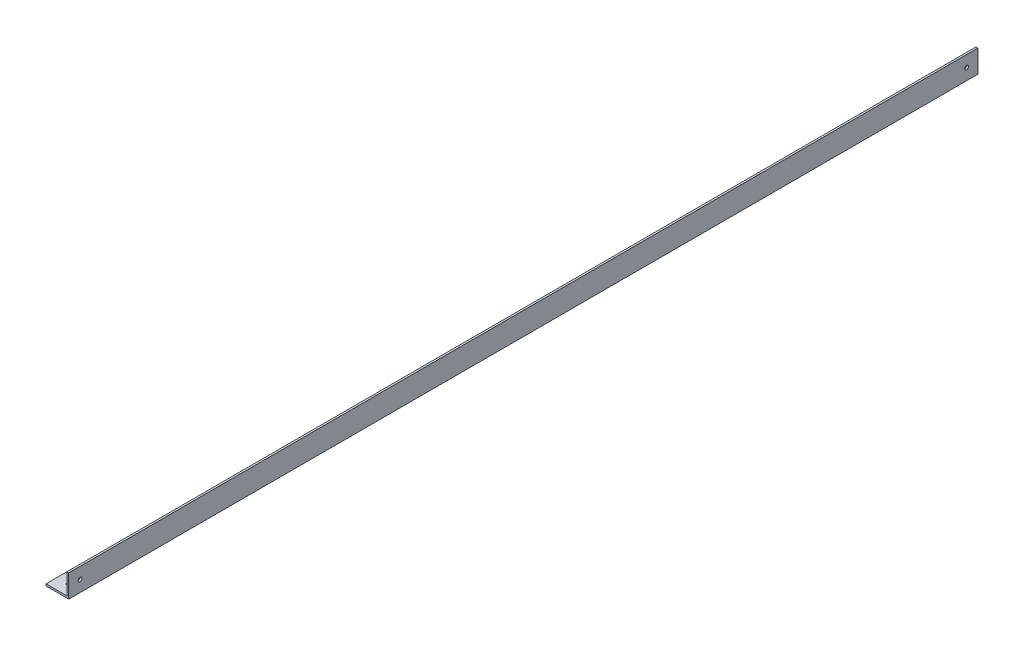
ISO-10303-21;
HEADER;
FILE_DESCRIPTION(('STEP AP214'),'2;1');
FILE_NAME('part.step','',(''),(''),'','','');
FILE_SCHEMA(('AUTOMOTIVE_DESIGN { 1 0 10303 214 1 1 1 1 }'));
ENDSEC;
DATA;
#1=APPLICATION_CONTEXT('core data for automotive mechanical design processes');
#2=APPLICATION_PROTOCOL_DEFINITION('international standard','automotive_design',2000,#1);
#3=PRODUCT_CONTEXT('',#1,'mechanical');
#4=PRODUCT('Part','Part','',(#3));
#5=PRODUCT_RELATED_PRODUCT_CATEGORY('part','',(#4));
#6=PRODUCT_DEFINITION_FORMATION('','',#4);
#7=PRODUCT_DEFINITION_CONTEXT('part definition',#1,'design');
#8=PRODUCT_DEFINITION('design','',#6,#7);
#9=PRODUCT_DEFINITION_SHAPE('','',#8);
#10=(LENGTH_UNIT() NAMED_UNIT(*) SI_UNIT(.MILLI.,.METRE.));
#11=(NAMED_UNIT(*) PLANE_ANGLE_UNIT() SI_UNIT($,.RADIAN.));
#12=(NAMED_UNIT(*) SI_UNIT($,.STERADIAN.) SOLID_ANGLE_UNIT());
#13=UNCERTAINTY_MEASURE_WITH_UNIT(LENGTH_MEASURE(1.E-05),#10,'distance_accuracy_value','');
#14=(GEOMETRIC_REPRESENTATION_CONTEXT(3) GLOBAL_UNCERTAINTY_ASSIGNED_CONTEXT((#13)) GLOBAL_UNIT_ASSIGNED_CONTEXT((#10,
#11,#12)) REPRESENTATION_CONTEXT('',''));
#15=CARTESIAN_POINT('',(0.,0.,0.));
#16=DIRECTION('',(0.,0.,1.));
#17=DIRECTION('',(1.,0.,0.));
#18=AXIS2_PLACEMENT_3D('',#15,#16,#17);
#19=CARTESIAN_POINT('',(0.,0.,-762.));
#20=DIRECTION('',(0.,-1.,0.));
#21=DIRECTION('',(0.,0.,-1.));
#22=AXIS2_PLACEMENT_3D('',#19,#20,#21);
#23=PLANE('',#22);
#24=DIRECTION('',(0.,0.,1.));
#25=VECTOR('',#24,1.);
#26=CARTESIAN_POINT('',(19.05,0.,-762.));
#27=LINE('',#26,#25);
#28=CARTESIAN_POINT('',(19.05,0.,-762.));
#29=VERTEX_POINT('',#28);
#30=CARTESIAN_POINT('',(19.05,0.,0.));
#31=VERTEX_POINT('',#30);
#32=EDGE_CURVE('E52',#29,#31,#27,.T.);
#33=ORIENTED_EDGE('',*,*,#32,.F.);
#34=DIRECTION('',(1.,0.,0.));
#35=VECTOR('',#34,1.);
#36=CARTESIAN_POINT('',(0.,0.,-762.));
#37=LINE('',#36,#35);
#38=CARTESIAN_POINT('',(38.1,0.,-762.));
#39=VERTEX_POINT('',#38);
#40=EDGE_CURVE('E44',#29,#39,#37,.T.);
#41=ORIENTED_EDGE('',*,*,#40,.T.);
#42=DIRECTION('',(0.,0.,1.));
#43=VECTOR('',#42,1.);
#44=CARTESIAN_POINT('',(38.1,0.,-762.));
#45=LINE('',#44,#43);
#46=CARTESIAN_POINT('',(38.1,0.,0.));
#47=VERTEX_POINT('',#46);
#48=EDGE_CURVE('E111',#39,#47,#45,.T.);
#49=ORIENTED_EDGE('',*,*,#48,.T.);
#50=DIRECTION('',(1.,0.,0.));
#51=VECTOR('',#50,1.);
#52=CARTESIAN_POINT('',(0.,0.,0.));
#53=LINE('',#52,#51);
#54=EDGE_CURVE('E102',#31,#47,#53,.T.);
#55=ORIENTED_EDGE('',*,*,#54,.F.);
#56=EDGE_LOOP('',(#33,#41,#49,#55));
#57=FACE_BOUND('',#56,.T.);
#58=CARTESIAN_POINT('',(28.575,0.,-9.525));
#59=DIRECTION('',(0.,-1.,0.));
#60=DIRECTION('',(0.,0.,-1.));
#61=AXIS2_PLACEMENT_3D('',#58,#59,#60);
#62=CIRCLE('',#61,1.5875);
#63=CARTESIAN_POINT('',(28.575,0.,-11.1125));
#64=VERTEX_POINT('',#63);
#65=EDGE_CURVE('E151',#64,#64,#62,.F.);
#66=ORIENTED_EDGE('',*,*,#65,.T.);
#67=EDGE_LOOP('',(#66));
#68=FACE_BOUND('',#67,.T.);
#69=CARTESIAN_POINT('',(28.575,0.,-703.58));
#70=DIRECTION('',(0.,-1.,0.));
#71=DIRECTION('',(0.,0.,-1.));
#72=AXIS2_PLACEMENT_3D('',#69,#70,#71);
#73=CIRCLE('',#72,3.175);
#74=CARTESIAN_POINT('',(28.575,0.,-706.755));
#75=VERTEX_POINT('',#74);
#76=EDGE_CURVE('E148',#75,#75,#73,.F.);
#77=ORIENTED_EDGE('',*,*,#76,.T.);
#78=EDGE_LOOP('',(#77));
#79=FACE_BOUND('',#78,.T.);
#80=CARTESIAN_POINT('',(28.575,0.,-76.2));
#81=DIRECTION('',(0.,-1.,0.));
#82=DIRECTION('',(0.,0.,-1.));
#83=AXIS2_PLACEMENT_3D('',#80,#81,#82);
#84=CIRCLE('',#83,3.175);
#85=CARTESIAN_POINT('',(28.575,0.,-79.375));
#86=VERTEX_POINT('',#85);
#87=EDGE_CURVE('E145',#86,#86,#84,.F.);
#88=ORIENTED_EDGE('',*,*,#87,.T.);
#89=EDGE_LOOP('',(#88));
#90=FACE_BOUND('',#89,.T.);
#91=CARTESIAN_POINT('',(28.575,0.,-752.475));
#92=DIRECTION('',(0.,-1.,0.));
#93=DIRECTION('',(0.,0.,-1.));
#94=AXIS2_PLACEMENT_3D('',#91,#92,#93);
#95=CIRCLE('',#94,1.58750000000003);
#96=CARTESIAN_POINT('',(28.575,0.,-754.0625));
#97=VERTEX_POINT('',#96);
#98=EDGE_CURVE('E134',#97,#97,#95,.F.);
#99=ORIENTED_EDGE('',*,*,#98,.T.);
#100=EDGE_LOOP('',(#99));
#101=FACE_BOUND('',#100,.T.);
#102=ADVANCED_FACE('F36',(#57,#68,#79,#90,#101),#23,.T.);
#103=CARTESIAN_POINT('',(19.05,1.5875,-762.));
#104=DIRECTION('',(0.,1.,0.));
#105=DIRECTION('',(0.,0.,1.));
#106=AXIS2_PLACEMENT_3D('',#103,#104,#105);
#107=PLANE('',#106);
#108=DIRECTION('',(0.,0.,-1.));
#109=VECTOR('',#108,1.);
#110=CARTESIAN_POINT('',(19.05,1.5875,-762.));
#111=LINE('',#110,#109);
#112=CARTESIAN_POINT('',(19.05,1.5875,0.));
#113=VERTEX_POINT('',#112);
#114=CARTESIAN_POINT('',(19.05,1.5875,-762.));
#115=VERTEX_POINT('',#114);
#116=EDGE_CURVE('E97',#113,#115,#111,.T.);
#117=ORIENTED_EDGE('',*,*,#116,.F.);
#118=DIRECTION('',(-1.,0.,0.));
#119=VECTOR('',#118,1.);
#120=CARTESIAN_POINT('',(19.05,1.5875,0.));
#121=LINE('',#120,#119);
#122=CARTESIAN_POINT('',(36.5125,1.5875,0.));
#123=VERTEX_POINT('',#122);
#124=EDGE_CURVE('E80',#123,#113,#121,.T.);
#125=ORIENTED_EDGE('',*,*,#124,.F.);
#126=DIRECTION('',(0.,0.,1.));
#127=VECTOR('',#126,1.);
#128=CARTESIAN_POINT('',(36.5125,1.5875,-762.));
#129=LINE('',#128,#127);
#130=CARTESIAN_POINT('',(36.5125,1.5875,-762.));
#131=VERTEX_POINT('',#130);
#132=EDGE_CURVE('E114',#131,#123,#129,.T.);
#133=ORIENTED_EDGE('',*,*,#132,.F.);
#134=DIRECTION('',(-1.,0.,0.));
#135=VECTOR('',#134,1.);
#136=CARTESIAN_POINT('',(19.05,1.5875,-762.));
#137=LINE('',#136,#135);
#138=EDGE_CURVE('E11',#131,#115,#137,.T.);
#139=ORIENTED_EDGE('',*,*,#138,.T.);
#140=EDGE_LOOP('',(#117,#125,#133,#139));
#141=FACE_BOUND('',#140,.T.);
#142=CARTESIAN_POINT('',(28.575,1.5875,-9.525));
#143=DIRECTION('',(0.,-1.,0.));
#144=DIRECTION('',(0.,0.,1.));
#145=AXIS2_PLACEMENT_3D('',#142,#143,#144);
#146=CIRCLE('',#145,1.5875);
#147=CARTESIAN_POINT('',(28.575,1.5875,-7.9375));
#148=VERTEX_POINT('',#147);
#149=EDGE_CURVE('E131',#148,#148,#146,.T.);
#150=ORIENTED_EDGE('',*,*,#149,.T.);
#151=EDGE_LOOP('',(#150));
#152=FACE_BOUND('',#151,.T.);
#153=CARTESIAN_POINT('',(28.575,1.5875,-703.58));
#154=DIRECTION('',(0.,-1.,0.));
#155=DIRECTION('',(0.,0.,1.));
#156=AXIS2_PLACEMENT_3D('',#153,#154,#155);
#157=CIRCLE('',#156,3.175);
#158=CARTESIAN_POINT('',(28.575,1.5875,-700.405));
#159=VERTEX_POINT('',#158);
#160=EDGE_CURVE('E121',#159,#159,#157,.T.);
#161=ORIENTED_EDGE('',*,*,#160,.T.);
#162=EDGE_LOOP('',(#161));
#163=FACE_BOUND('',#162,.T.);
#164=CARTESIAN_POINT('',(28.575,1.5875,-76.2));
#165=DIRECTION('',(0.,-1.,0.));
#166=DIRECTION('',(0.,0.,1.));
#167=AXIS2_PLACEMENT_3D('',#164,#165,#166);
#168=CIRCLE('',#167,3.175);
#169=CARTESIAN_POINT('',(28.575,1.5875,-73.025));
#170=VERTEX_POINT('',#169);
#171=EDGE_CURVE('E138',#170,#170,#168,.T.);
#172=ORIENTED_EDGE('',*,*,#171,.T.);
#173=EDGE_LOOP('',(#172));
#174=FACE_BOUND('',#173,.T.);
#175=CARTESIAN_POINT('',(28.575,1.5875,-752.475));
#176=DIRECTION('',(0.,-1.,0.));
#177=DIRECTION('',(0.,0.,1.));
#178=AXIS2_PLACEMENT_3D('',#175,#176,#177);
#179=CIRCLE('',#178,1.58750000000003);
#180=CARTESIAN_POINT('',(28.575,1.5875,-750.8875));
#181=VERTEX_POINT('',#180);
#182=EDGE_CURVE('E135',#181,#181,#179,.T.);
#183=ORIENTED_EDGE('',*,*,#182,.T.);
#184=EDGE_LOOP('',(#183));
#185=FACE_BOUND('',#184,.T.);
#186=ADVANCED_FACE('F180',(#141,#152,#163,#174,#185),#107,.T.);
#187=CARTESIAN_POINT('',(0.,0.,-762.));
#188=DIRECTION('',(0.,0.,1.));
#189=DIRECTION('',(1.,0.,0.));
#190=AXIS2_PLACEMENT_3D('',#187,#188,#189);
#191=PLANE('',#190);
#192=ORIENTED_EDGE('',*,*,#40,.F.);
#193=DIRECTION('',(0.,1.,0.));
#194=VECTOR('',#193,1.);
#195=CARTESIAN_POINT('',(19.05,19.05,-762.));
#196=LINE('',#195,#194);
#197=EDGE_CURVE('E95',#29,#115,#196,.T.);
#198=ORIENTED_EDGE('',*,*,#197,.T.);
#199=ORIENTED_EDGE('',*,*,#138,.F.);
#200=DIRECTION('',(0.,1.,0.));
#201=VECTOR('',#200,1.);
#202=CARTESIAN_POINT('',(36.5125,1.5875,-762.));
#203=LINE('',#202,#201);
#204=CARTESIAN_POINT('',(36.5125,19.05,-762.));
#205=VERTEX_POINT('',#204);
#206=EDGE_CURVE('E159',#131,#205,#203,.T.);
#207=ORIENTED_EDGE('',*,*,#206,.T.);
#208=DIRECTION('',(1.,0.,0.));
#209=VECTOR('',#208,1.);
#210=CARTESIAN_POINT('',(38.1,19.05,-762.));
#211=LINE('',#210,#209);
#212=CARTESIAN_POINT('',(38.1,19.05,-762.));
#213=VERTEX_POINT('',#212);
#214=EDGE_CURVE('E156',#205,#213,#211,.T.);
#215=ORIENTED_EDGE('',*,*,#214,.T.);
#216=DIRECTION('',(0.,-1.,0.));
#217=VECTOR('',#216,1.);
#218=CARTESIAN_POINT('',(38.1,0.,-762.));
#219=LINE('',#218,#217);
#220=EDGE_CURVE('E106',#213,#39,#219,.T.);
#221=ORIENTED_EDGE('',*,*,#220,.T.);
#222=EDGE_LOOP('',(#192,#198,#199,#207,#215,#221));
#223=FACE_BOUND('',#222,.T.);
#224=ADVANCED_FACE('F104',(#223),#191,.F.);
#225=CARTESIAN_POINT('',(0.,0.,0.));
#226=DIRECTION('',(0.,0.,1.));
#227=DIRECTION('',(1.,0.,0.));
#228=AXIS2_PLACEMENT_3D('',#225,#226,#227);
#229=PLANE('',#228);
#230=DIRECTION('',(0.,1.,0.));
#231=VECTOR('',#230,1.);
#232=CARTESIAN_POINT('',(19.05,19.05,0.));
#233=LINE('',#232,#231);
#234=EDGE_CURVE('E98',#31,#113,#233,.T.);
#235=ORIENTED_EDGE('',*,*,#234,.F.);
#236=ORIENTED_EDGE('',*,*,#54,.T.);
#237=DIRECTION('',(0.,-1.,0.));
#238=VECTOR('',#237,1.);
#239=CARTESIAN_POINT('',(38.1,0.,0.));
#240=LINE('',#239,#238);
#241=CARTESIAN_POINT('',(38.1,19.05,0.));
#242=VERTEX_POINT('',#241);
#243=EDGE_CURVE('E154',#242,#47,#240,.T.);
#244=ORIENTED_EDGE('',*,*,#243,.F.);
#245=DIRECTION('',(1.,0.,0.));
#246=VECTOR('',#245,1.);
#247=CARTESIAN_POINT('',(38.1,19.05,0.));
#248=LINE('',#247,#246);
#249=CARTESIAN_POINT('',(36.5125,19.05,0.));
#250=VERTEX_POINT('',#249);
#251=EDGE_CURVE('E163',#250,#242,#248,.T.);
#252=ORIENTED_EDGE('',*,*,#251,.F.);
#253=DIRECTION('',(0.,1.,0.));
#254=VECTOR('',#253,1.);
#255=CARTESIAN_POINT('',(36.5125,1.5875,0.));
#256=LINE('',#255,#254);
#257=EDGE_CURVE('E157',#123,#250,#256,.T.);
#258=ORIENTED_EDGE('',*,*,#257,.F.);
#259=ORIENTED_EDGE('',*,*,#124,.T.);
#260=EDGE_LOOP('',(#235,#236,#244,#252,#258,#259));
#261=FACE_BOUND('',#260,.T.);
#262=ADVANCED_FACE('F177',(#261),#229,.T.);
#263=CARTESIAN_POINT('',(36.5125,1.5875,-762.));
#264=DIRECTION('',(1.,0.,0.));
#265=DIRECTION('',(0.,0.,-1.));
#266=AXIS2_PLACEMENT_3D('',#263,#264,#265);
#267=PLANE('',#266);
#268=CARTESIAN_POINT('',(36.5125,9.525,-752.475));
#269=DIRECTION('',(1.,0.,0.));
#270=DIRECTION('',(0.,0.,-1.));
#271=AXIS2_PLACEMENT_3D('',#268,#269,#270);
#272=CIRCLE('',#271,1.58749999999993);
#273=CARTESIAN_POINT('',(36.5125,9.525,-750.8875));
#274=VERTEX_POINT('',#273);
#275=EDGE_CURVE('E117',#274,#274,#272,.T.);
#276=ORIENTED_EDGE('',*,*,#275,.T.);
#277=EDGE_LOOP('',(#276));
#278=FACE_BOUND('',#277,.T.);
#279=CARTESIAN_POINT('',(36.5125,9.525,-9.525));
#280=DIRECTION('',(1.,0.,0.));
#281=DIRECTION('',(0.,0.,-1.));
#282=AXIS2_PLACEMENT_3D('',#279,#280,#281);
#283=CIRCLE('',#282,1.5875);
#284=CARTESIAN_POINT('',(36.5125,9.525,-7.9375));
#285=VERTEX_POINT('',#284);
#286=EDGE_CURVE('E123',#285,#285,#283,.T.);
#287=ORIENTED_EDGE('',*,*,#286,.T.);
#288=EDGE_LOOP('',(#287));
#289=FACE_BOUND('',#288,.T.);
#290=ORIENTED_EDGE('',*,*,#257,.T.);
#291=DIRECTION('',(0.,0.,1.));
#292=VECTOR('',#291,1.);
#293=CARTESIAN_POINT('',(36.5125,19.05,-762.));
#294=LINE('',#293,#292);
#295=EDGE_CURVE('E167',#205,#250,#294,.T.);
#296=ORIENTED_EDGE('',*,*,#295,.F.);
#297=ORIENTED_EDGE('',*,*,#206,.F.);
#298=ORIENTED_EDGE('',*,*,#132,.T.);
#299=EDGE_LOOP('',(#290,#296,#297,#298));
#300=FACE_BOUND('',#299,.T.);
#301=ADVANCED_FACE('F185',(#278,#289,#300),#267,.F.);
#302=CARTESIAN_POINT('',(38.1,19.05,-762.));
#303=DIRECTION('',(0.,-1.,0.));
#304=DIRECTION('',(0.,0.,-1.));
#305=AXIS2_PLACEMENT_3D('',#302,#303,#304);
#306=PLANE('',#305);
#307=ORIENTED_EDGE('',*,*,#251,.T.);
#308=DIRECTION('',(0.,0.,1.));
#309=VECTOR('',#308,1.);
#310=CARTESIAN_POINT('',(38.1,19.05,-762.));
#311=LINE('',#310,#309);
#312=EDGE_CURVE('E169',#213,#242,#311,.T.);
#313=ORIENTED_EDGE('',*,*,#312,.F.);
#314=ORIENTED_EDGE('',*,*,#214,.F.);
#315=ORIENTED_EDGE('',*,*,#295,.T.);
#316=EDGE_LOOP('',(#307,#313,#314,#315));
#317=FACE_BOUND('',#316,.T.);
#318=ADVANCED_FACE('F188',(#317),#306,.F.);
#319=CARTESIAN_POINT('',(38.1,0.,-762.));
#320=DIRECTION('',(-1.,0.,0.));
#321=DIRECTION('',(0.,0.,1.));
#322=AXIS2_PLACEMENT_3D('',#319,#320,#321);
#323=PLANE('',#322);
#324=CARTESIAN_POINT('',(38.1,9.525,-752.475));
#325=DIRECTION('',(-1.,0.,0.));
#326=DIRECTION('',(0.,0.,1.));
#327=AXIS2_PLACEMENT_3D('',#324,#325,#326);
#328=CIRCLE('',#327,1.58749999999993);
#329=CARTESIAN_POINT('',(38.1,9.525,-750.8875));
#330=VERTEX_POINT('',#329);
#331=EDGE_CURVE('E39',#330,#330,#328,.F.);
#332=ORIENTED_EDGE('',*,*,#331,.F.);
#333=EDGE_LOOP('',(#332));
#334=FACE_BOUND('',#333,.T.);
#335=CARTESIAN_POINT('',(38.1,9.525,-9.525));
#336=DIRECTION('',(-1.,0.,0.));
#337=DIRECTION('',(0.,0.,1.));
#338=AXIS2_PLACEMENT_3D('',#335,#336,#337);
#339=CIRCLE('',#338,1.5875);
#340=CARTESIAN_POINT('',(38.1,9.525,-7.9375));
#341=VERTEX_POINT('',#340);
#342=EDGE_CURVE('E115',#341,#341,#339,.F.);
#343=ORIENTED_EDGE('',*,*,#342,.F.);
#344=EDGE_LOOP('',(#343));
#345=FACE_BOUND('',#344,.T.);
#346=ORIENTED_EDGE('',*,*,#243,.T.);
#347=ORIENTED_EDGE('',*,*,#48,.F.);
#348=ORIENTED_EDGE('',*,*,#220,.F.);
#349=ORIENTED_EDGE('',*,*,#312,.T.);
#350=EDGE_LOOP('',(#346,#347,#348,#349));
#351=FACE_BOUND('',#350,.T.);
#352=ADVANCED_FACE('F174',(#334,#345,#351),#323,.F.);
#353=CARTESIAN_POINT('',(28.575,-1.2065,-752.475));
#354=DIRECTION('',(0.,1.,0.));
#355=DIRECTION('',(0.,0.,1.));
#356=AXIS2_PLACEMENT_3D('',#353,#354,#355);
#357=CYLINDRICAL_SURFACE('',#356,1.58750000000003);
#358=ORIENTED_EDGE('',*,*,#98,.F.);
#359=EDGE_LOOP('',(#358));
#360=FACE_BOUND('',#359,.T.);
#361=ORIENTED_EDGE('',*,*,#182,.F.);
#362=EDGE_LOOP('',(#361));
#363=FACE_BOUND('',#362,.T.);
#364=ADVANCED_FACE('F195',(#360,#363),#357,.F.);
#365=CARTESIAN_POINT('',(28.575,-1.2065,-76.2));
#366=DIRECTION('',(0.,1.,0.));
#367=DIRECTION('',(0.,0.,1.));
#368=AXIS2_PLACEMENT_3D('',#365,#366,#367);
#369=CYLINDRICAL_SURFACE('',#368,3.175);
#370=ORIENTED_EDGE('',*,*,#87,.F.);
#371=EDGE_LOOP('',(#370));
#372=FACE_BOUND('',#371,.T.);
#373=ORIENTED_EDGE('',*,*,#171,.F.);
#374=EDGE_LOOP('',(#373));
#375=FACE_BOUND('',#374,.T.);
#376=ADVANCED_FACE('F237',(#372,#375),#369,.F.);
#377=CARTESIAN_POINT('',(28.575,-1.2065,-703.58));
#378=DIRECTION('',(0.,1.,0.));
#379=DIRECTION('',(0.,0.,1.));
#380=AXIS2_PLACEMENT_3D('',#377,#378,#379);
#381=CYLINDRICAL_SURFACE('',#380,3.175);
#382=ORIENTED_EDGE('',*,*,#76,.F.);
#383=EDGE_LOOP('',(#382));
#384=FACE_BOUND('',#383,.T.);
#385=ORIENTED_EDGE('',*,*,#160,.F.);
#386=EDGE_LOOP('',(#385));
#387=FACE_BOUND('',#386,.T.);
#388=ADVANCED_FACE('F247',(#384,#387),#381,.F.);
#389=CARTESIAN_POINT('',(28.575,-1.2065,-9.525));
#390=DIRECTION('',(0.,1.,0.));
#391=DIRECTION('',(0.,0.,1.));
#392=AXIS2_PLACEMENT_3D('',#389,#390,#391);
#393=CYLINDRICAL_SURFACE('',#392,1.5875);
#394=ORIENTED_EDGE('',*,*,#65,.F.);
#395=EDGE_LOOP('',(#394));
#396=FACE_BOUND('',#395,.T.);
#397=ORIENTED_EDGE('',*,*,#149,.F.);
#398=EDGE_LOOP('',(#397));
#399=FACE_BOUND('',#398,.T.);
#400=ADVANCED_FACE('F257',(#396,#399),#393,.F.);
#401=CARTESIAN_POINT('',(45.4025,9.525,-9.525));
#402=DIRECTION('',(-1.,0.,0.));
#403=DIRECTION('',(0.,0.,1.));
#404=AXIS2_PLACEMENT_3D('',#401,#402,#403);
#405=CYLINDRICAL_SURFACE('',#404,1.5875);
#406=CARTESIAN_POINT('',(36.5125,9.525,-7.9375));
#407=CARTESIAN_POINT('',(36.5290364583333,9.525,-7.9375));
#408=CARTESIAN_POINT('',(36.5455729166667,9.525,-7.9375));
#409=CARTESIAN_POINT('',(36.5786458333333,9.525,-7.9375));
#410=CARTESIAN_POINT('',(36.5951822916667,9.525,-7.9375));
#411=CARTESIAN_POINT('',(36.6282552083333,9.525,-7.9375));
#412=CARTESIAN_POINT('',(36.6447916666667,9.525,-7.9375));
#413=CARTESIAN_POINT('',(36.6778645833333,9.525,-7.9375));
#414=CARTESIAN_POINT('',(36.6944010416667,9.525,-7.9375));
#415=CARTESIAN_POINT('',(36.7274739583333,9.525,-7.9375));
#416=CARTESIAN_POINT('',(36.7440104166667,9.525,-7.9375));
#417=CARTESIAN_POINT('',(36.7770833333333,9.525,-7.9375));
#418=CARTESIAN_POINT('',(36.7936197916667,9.525,-7.9375));
#419=CARTESIAN_POINT('',(36.8266927083333,9.525,-7.9375));
#420=CARTESIAN_POINT('',(36.8432291666667,9.525,-7.9375));
#421=CARTESIAN_POINT('',(36.8763020833333,9.525,-7.9375));
#422=CARTESIAN_POINT('',(36.8928385416667,9.525,-7.9375));
#423=CARTESIAN_POINT('',(36.9259114583333,9.525,-7.9375));
#424=CARTESIAN_POINT('',(36.9424479166667,9.525,-7.9375));
#425=CARTESIAN_POINT('',(36.9755208333333,9.525,-7.9375));
#426=CARTESIAN_POINT('',(36.9920572916667,9.525,-7.9375));
#427=CARTESIAN_POINT('',(37.0251302083333,9.525,-7.9375));
#428=CARTESIAN_POINT('',(37.0416666666667,9.525,-7.9375));
#429=CARTESIAN_POINT('',(37.0747395833333,9.525,-7.9375));
#430=CARTESIAN_POINT('',(37.0912760416667,9.525,-7.9375));
#431=CARTESIAN_POINT('',(37.1243489583333,9.525,-7.9375));
#432=CARTESIAN_POINT('',(37.1408854166667,9.525,-7.9375));
#433=CARTESIAN_POINT('',(37.1739583333333,9.525,-7.9375));
#434=CARTESIAN_POINT('',(37.1904947916667,9.525,-7.9375));
#435=CARTESIAN_POINT('',(37.2235677083333,9.525,-7.9375));
#436=CARTESIAN_POINT('',(37.2401041666667,9.525,-7.9375));
#437=CARTESIAN_POINT('',(37.2731770833333,9.525,-7.9375));
#438=CARTESIAN_POINT('',(37.2897135416667,9.525,-7.9375));
#439=CARTESIAN_POINT('',(37.3227864583333,9.525,-7.9375));
#440=CARTESIAN_POINT('',(37.3393229166667,9.525,-7.9375));
#441=CARTESIAN_POINT('',(37.3723958333333,9.525,-7.9375));
#442=CARTESIAN_POINT('',(37.3889322916667,9.525,-7.9375));
#443=CARTESIAN_POINT('',(37.4220052083333,9.525,-7.9375));
#444=CARTESIAN_POINT('',(37.4385416666667,9.525,-7.9375));
#445=CARTESIAN_POINT('',(37.4716145833333,9.525,-7.9375));
#446=CARTESIAN_POINT('',(37.4881510416667,9.525,-7.9375));
#447=CARTESIAN_POINT('',(37.5212239583333,9.525,-7.9375));
#448=CARTESIAN_POINT('',(37.5377604166667,9.525,-7.9375));
#449=CARTESIAN_POINT('',(37.5708333333333,9.525,-7.9375));
#450=CARTESIAN_POINT('',(37.5873697916667,9.525,-7.9375));
#451=CARTESIAN_POINT('',(37.6204427083333,9.525,-7.9375));
#452=CARTESIAN_POINT('',(37.6369791666667,9.525,-7.9375));
#453=CARTESIAN_POINT('',(37.6700520833333,9.525,-7.9375));
#454=CARTESIAN_POINT('',(37.6865885416667,9.525,-7.9375));
#455=CARTESIAN_POINT('',(37.7196614583333,9.525,-7.9375));
#456=CARTESIAN_POINT('',(37.7361979166667,9.525,-7.9375));
#457=CARTESIAN_POINT('',(37.7692708333333,9.525,-7.9375));
#458=CARTESIAN_POINT('',(37.7858072916667,9.525,-7.9375));
#459=CARTESIAN_POINT('',(37.8188802083333,9.525,-7.9375));
#460=CARTESIAN_POINT('',(37.8354166666667,9.525,-7.9375));
#461=CARTESIAN_POINT('',(37.8684895833333,9.525,-7.9375));
#462=CARTESIAN_POINT('',(37.8850260416667,9.525,-7.9375));
#463=CARTESIAN_POINT('',(37.9180989583333,9.525,-7.9375));
#464=CARTESIAN_POINT('',(37.9346354166667,9.525,-7.9375));
#465=CARTESIAN_POINT('',(37.9677083333333,9.525,-7.9375));
#466=CARTESIAN_POINT('',(37.9842447916667,9.525,-7.9375));
#467=CARTESIAN_POINT('',(38.0173177083333,9.525,-7.9375));
#468=CARTESIAN_POINT('',(38.0338541666667,9.525,-7.9375));
#469=CARTESIAN_POINT('',(38.0669270833333,9.525,-7.9375));
#470=CARTESIAN_POINT('',(38.0834635416667,9.525,-7.9375));
#471=CARTESIAN_POINT('',(38.1,9.525,-7.9375));
#472=B_SPLINE_CURVE_WITH_KNOTS('',3,(#406,#407,#408,#409,#410,#411,#412,#413,#414,#415,#416,
#417,#418,#419,#420,#421,#422,#423,#424,#425,#426,#427,#428,#429,#430,#431,#432,#433,#434,#435,
#436,#437,#438,#439,#440,#441,#442,#443,#444,#445,#446,#447,#448,#449,#450,#451,#452,#453,#454,
#455,#456,#457,#458,#459,#460,#461,#462,#463,#464,#465,#466,#467,#468,#469,#470,#471),
.UNSPECIFIED.,.F.,.F.,(4,2,2,2,2,2,2,2,2,2,2,2,2,2,2,2,2,2,2,2,2,2,2,2,2,2,2,2,2,2,2,2,4),(0.,
0.0496093750000023,0.0992187500000047,0.148828125,0.198437500000002,0.248046875000005,
0.297656250000007,0.347265625000003,0.396875000000005,0.446484375000007,0.496093750000003,
0.545703125000005,0.595312500000007,0.644921875000003,0.694531250000005,0.744140625000007,
0.793750000000003,0.843359375000005,0.892968750000007,0.942578125000003,0.992187500000005,
1.04179687500001,1.09140625,1.14101562500001,1.19062500000001,1.240234375,1.28984375000001,
1.33945312500001,1.38906250000001,1.43867187500001,1.48828125000001,1.53789062500001,
1.58750000000001),.UNSPECIFIED.);
#473=EDGE_CURVE('BSEAM267',#285,#341,#472,.T.);
#474=ORIENTED_EDGE('',*,*,#286,.F.);
#475=ORIENTED_EDGE('',*,*,#342,.T.);
#476=ORIENTED_EDGE('',*,*,#473,.T.);
#477=ORIENTED_EDGE('',*,*,#473,.F.);
#478=EDGE_LOOP('',(#474,#476,#475,#477));
#479=FACE_BOUND('',#478,.T.);
#480=ADVANCED_FACE('F267',(#479),#405,.F.);
#481=CARTESIAN_POINT('',(45.4025,9.525,-752.475));
#482=DIRECTION('',(-1.,0.,0.));
#483=DIRECTION('',(0.,0.,1.));
#484=AXIS2_PLACEMENT_3D('',#481,#482,#483);
#485=CYLINDRICAL_SURFACE('',#484,1.58749999999993);
#486=CARTESIAN_POINT('',(36.5125,9.525,-750.8875));
#487=CARTESIAN_POINT('',(36.5290364583333,9.525,-750.8875));
#488=CARTESIAN_POINT('',(36.5455729166667,9.525,-750.8875));
#489=CARTESIAN_POINT('',(36.5786458333333,9.525,-750.8875));
#490=CARTESIAN_POINT('',(36.5951822916667,9.525,-750.8875));
#491=CARTESIAN_POINT('',(36.6282552083333,9.525,-750.8875));
#492=CARTESIAN_POINT('',(36.6447916666667,9.525,-750.8875));
#493=CARTESIAN_POINT('',(36.6778645833333,9.525,-750.8875));
#494=CARTESIAN_POINT('',(36.6944010416667,9.525,-750.8875));
#495=CARTESIAN_POINT('',(36.7274739583333,9.525,-750.8875));
#496=CARTESIAN_POINT('',(36.7440104166667,9.525,-750.8875));
#497=CARTESIAN_POINT('',(36.7770833333333,9.525,-750.8875));
#498=CARTESIAN_POINT('',(36.7936197916667,9.525,-750.8875));
#499=CARTESIAN_POINT('',(36.8266927083333,9.525,-750.8875));
#500=CARTESIAN_POINT('',(36.8432291666667,9.525,-750.8875));
#501=CARTESIAN_POINT('',(36.8763020833333,9.525,-750.8875));
#502=CARTESIAN_POINT('',(36.8928385416667,9.525,-750.8875));
#503=CARTESIAN_POINT('',(36.9259114583333,9.525,-750.8875));
#504=CARTESIAN_POINT('',(36.9424479166667,9.525,-750.8875));
#505=CARTESIAN_POINT('',(36.9755208333333,9.525,-750.8875));
#506=CARTESIAN_POINT('',(36.9920572916667,9.525,-750.8875));
#507=CARTESIAN_POINT('',(37.0251302083333,9.525,-750.8875));
#508=CARTESIAN_POINT('',(37.0416666666667,9.525,-750.8875));
#509=CARTESIAN_POINT('',(37.0747395833333,9.525,-750.8875));
#510=CARTESIAN_POINT('',(37.0912760416667,9.525,-750.8875));
#511=CARTESIAN_POINT('',(37.1243489583333,9.525,-750.8875));
#512=CARTESIAN_POINT('',(37.1408854166667,9.525,-750.8875));
#513=CARTESIAN_POINT('',(37.1739583333333,9.525,-750.8875));
#514=CARTESIAN_POINT('',(37.1904947916667,9.525,-750.8875));
#515=CARTESIAN_POINT('',(37.2235677083333,9.525,-750.8875));
#516=CARTESIAN_POINT('',(37.2401041666667,9.525,-750.8875));
#517=CARTESIAN_POINT('',(37.2731770833333,9.525,-750.8875));
#518=CARTESIAN_POINT('',(37.2897135416667,9.525,-750.8875));
#519=CARTESIAN_POINT('',(37.3227864583333,9.525,-750.8875));
#520=CARTESIAN_POINT('',(37.3393229166667,9.525,-750.8875));
#521=CARTESIAN_POINT('',(37.3723958333333,9.525,-750.8875));
#522=CARTESIAN_POINT('',(37.3889322916667,9.525,-750.8875));
#523=CARTESIAN_POINT('',(37.4220052083333,9.525,-750.8875));
#524=CARTESIAN_POINT('',(37.4385416666667,9.525,-750.8875));
#525=CARTESIAN_POINT('',(37.4716145833333,9.525,-750.8875));
#526=CARTESIAN_POINT('',(37.4881510416667,9.525,-750.8875));
#527=CARTESIAN_POINT('',(37.5212239583333,9.525,-750.8875));
#528=CARTESIAN_POINT('',(37.5377604166667,9.525,-750.8875));
#529=CARTESIAN_POINT('',(37.5708333333333,9.525,-750.8875));
#530=CARTESIAN_POINT('',(37.5873697916667,9.525,-750.8875));
#531=CARTESIAN_POINT('',(37.6204427083333,9.525,-750.8875));
#532=CARTESIAN_POINT('',(37.6369791666667,9.525,-750.8875));
#533=CARTESIAN_POINT('',(37.6700520833333,9.525,-750.8875));
#534=CARTESIAN_POINT('',(37.6865885416667,9.525,-750.8875));
#535=CARTESIAN_POINT('',(37.7196614583333,9.525,-750.8875));
#536=CARTESIAN_POINT('',(37.7361979166667,9.525,-750.8875));
#537=CARTESIAN_POINT('',(37.7692708333333,9.525,-750.8875));
#538=CARTESIAN_POINT('',(37.7858072916667,9.525,-750.8875));
#539=CARTESIAN_POINT('',(37.8188802083333,9.525,-750.8875));
#540=CARTESIAN_POINT('',(37.8354166666667,9.525,-750.8875));
#541=CARTESIAN_POINT('',(37.8684895833333,9.525,-750.8875));
#542=CARTESIAN_POINT('',(37.8850260416667,9.525,-750.8875));
#543=CARTESIAN_POINT('',(37.9180989583333,9.525,-750.8875));
#544=CARTESIAN_POINT('',(37.9346354166667,9.525,-750.8875));
#545=CARTESIAN_POINT('',(37.9677083333333,9.525,-750.8875));
#546=CARTESIAN_POINT('',(37.9842447916667,9.525,-750.8875));
#547=CARTESIAN_POINT('',(38.0173177083333,9.525,-750.8875));
#548=CARTESIAN_POINT('',(38.0338541666667,9.525,-750.8875));
#549=CARTESIAN_POINT('',(38.0669270833333,9.525,-750.8875));
#550=CARTESIAN_POINT('',(38.0834635416667,9.525,-750.8875));
#551=CARTESIAN_POINT('',(38.1,9.525,-750.8875));
#552=B_SPLINE_CURVE_WITH_KNOTS('',3,(#486,#487,#488,#489,#490,#491,#492,#493,#494,#495,#496,
#497,#498,#499,#500,#501,#502,#503,#504,#505,#506,#507,#508,#509,#510,#511,#512,#513,#514,#515,
#516,#517,#518,#519,#520,#521,#522,#523,#524,#525,#526,#527,#528,#529,#530,#531,#532,#533,#534,
#535,#536,#537,#538,#539,#540,#541,#542,#543,#544,#545,#546,#547,#548,#549,#550,#551),
.UNSPECIFIED.,.F.,.F.,(4,2,2,2,2,2,2,2,2,2,2,2,2,2,2,2,2,2,2,2,2,2,2,2,2,2,2,2,2,2,2,2,4),(0.,
0.0496093750000023,0.0992187500000047,0.148828125,0.198437500000002,0.248046875000005,
0.297656250000007,0.347265625000003,0.396875000000005,0.446484375000007,0.496093750000003,
0.545703125000005,0.595312500000007,0.644921875000003,0.694531250000005,0.744140625000007,
0.793750000000003,0.843359375000005,0.892968750000007,0.942578125000003,0.992187500000005,
1.04179687500001,1.09140625,1.14101562500001,1.19062500000001,1.240234375,1.28984375000001,
1.33945312500001,1.38906250000001,1.43867187500001,1.48828125000001,1.53789062500001,
1.58750000000001),.UNSPECIFIED.);
#553=EDGE_CURVE('BSEAM277',#274,#330,#552,.T.);
#554=ORIENTED_EDGE('',*,*,#275,.F.);
#555=ORIENTED_EDGE('',*,*,#331,.T.);
#556=ORIENTED_EDGE('',*,*,#553,.T.);
#557=ORIENTED_EDGE('',*,*,#553,.F.);
#558=EDGE_LOOP('',(#554,#556,#555,#557));
#559=FACE_BOUND('',#558,.T.);
#560=ADVANCED_FACE('F277',(#559),#485,.F.);
#561=CARTESIAN_POINT('',(19.05,19.05,-762.));
#562=DIRECTION('',(1.,0.,0.));
#563=DIRECTION('',(0.,1.,0.));
#564=AXIS2_PLACEMENT_3D('',#561,#562,#563);
#565=PLANE('',#564);
#566=ORIENTED_EDGE('',*,*,#116,.T.);
#567=ORIENTED_EDGE('',*,*,#197,.F.);
#568=ORIENTED_EDGE('',*,*,#32,.T.);
#569=ORIENTED_EDGE('',*,*,#234,.T.);
#570=EDGE_LOOP('',(#566,#567,#568,#569));
#571=FACE_BOUND('',#570,.T.);
#572=ADVANCED_FACE('F96',(#571),#565,.F.);
#573=CLOSED_SHELL('',(#102,#186,#224,#262,#301,#318,#352,#364,#376,#388,#400,#480,#560,#572));
#574=MANIFOLD_SOLID_BREP('B2',#573);
#575=ADVANCED_BREP_SHAPE_REPRESENTATION('',(#18,#574),#14);
#576=SHAPE_DEFINITION_REPRESENTATION(#9,#575);
ENDSEC;
END-ISO-10303-21;
